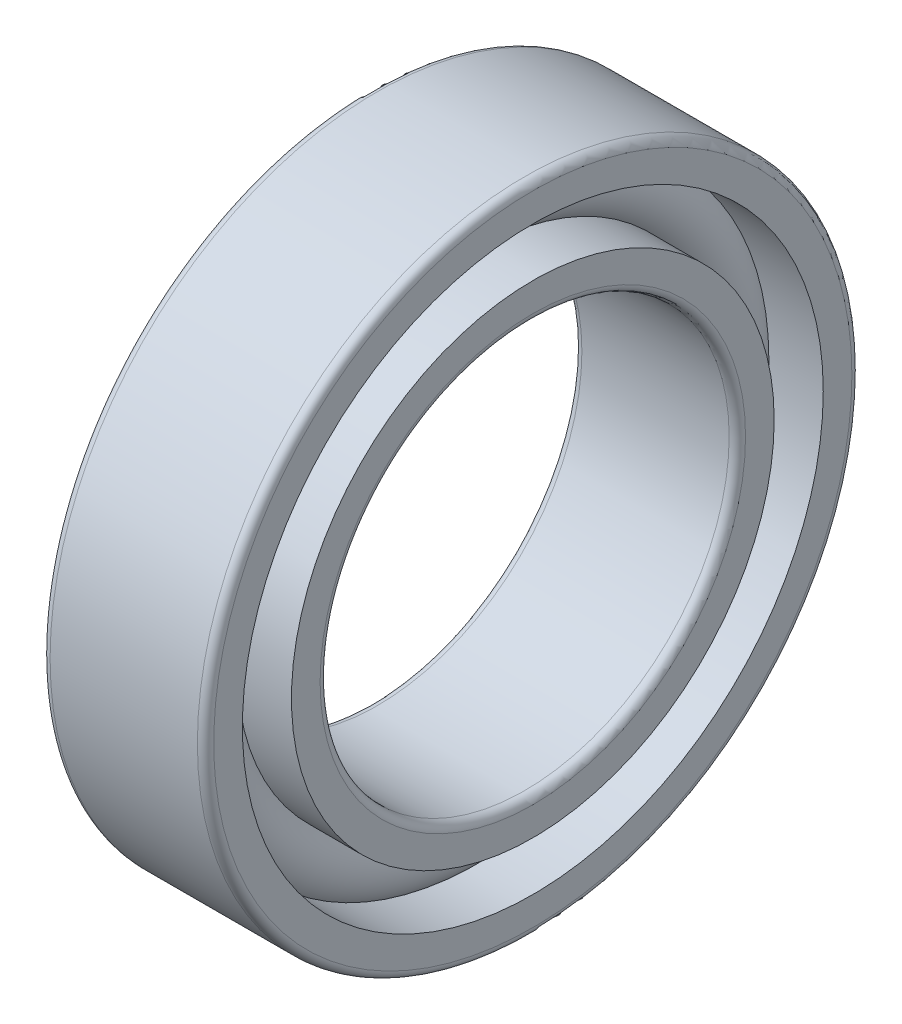
ISO-10303-21;
HEADER;
FILE_DESCRIPTION(('STEP AP214'),'2;1');
FILE_NAME('part.step','',(''),(''),'','','');
FILE_SCHEMA(('AUTOMOTIVE_DESIGN { 1 0 10303 214 1 1 1 1 }'));
ENDSEC;
DATA;
#1=APPLICATION_CONTEXT('core data for automotive mechanical design processes');
#2=APPLICATION_PROTOCOL_DEFINITION('international standard','automotive_design',2000,#1);
#3=PRODUCT_CONTEXT('',#1,'mechanical');
#4=PRODUCT('Part','Part','',(#3));
#5=PRODUCT_RELATED_PRODUCT_CATEGORY('part','',(#4));
#6=PRODUCT_DEFINITION_FORMATION('','',#4);
#7=PRODUCT_DEFINITION_CONTEXT('part definition',#1,'design');
#8=PRODUCT_DEFINITION('design','',#6,#7);
#9=PRODUCT_DEFINITION_SHAPE('','',#8);
#10=(LENGTH_UNIT() NAMED_UNIT(*) SI_UNIT(.MILLI.,.METRE.));
#11=(NAMED_UNIT(*) PLANE_ANGLE_UNIT() SI_UNIT($,.RADIAN.));
#12=(NAMED_UNIT(*) SI_UNIT($,.STERADIAN.) SOLID_ANGLE_UNIT());
#13=UNCERTAINTY_MEASURE_WITH_UNIT(LENGTH_MEASURE(1.E-05),#10,'distance_accuracy_value','');
#14=(GEOMETRIC_REPRESENTATION_CONTEXT(3) GLOBAL_UNCERTAINTY_ASSIGNED_CONTEXT((#13)) GLOBAL_UNIT_ASSIGNED_CONTEXT((#10,
#11,#12)) REPRESENTATION_CONTEXT('',''));
#15=CARTESIAN_POINT('',(0.,0.,0.));
#16=DIRECTION('',(0.,0.,1.));
#17=DIRECTION('',(1.,0.,0.));
#18=AXIS2_PLACEMENT_3D('',#15,#16,#17);
#19=CARTESIAN_POINT('',(0.,0.,0.));
#20=DIRECTION('',(-1.,0.,0.));
#21=DIRECTION('',(0.,0.,1.));
#22=AXIS2_PLACEMENT_3D('',#19,#20,#21);
#23=TOROIDAL_SURFACE('',#22,9.75,1.35);
#24=CARTESIAN_POINT('',(1.0062305898749,0.,0.));
#25=DIRECTION('',(-1.,0.,0.));
#26=DIRECTION('',(0.,0.,1.));
#27=AXIS2_PLACEMENT_3D('',#24,#25,#26);
#28=CIRCLE('',#27,10.65);
#29=CARTESIAN_POINT('',(1.0062305898749,0.,10.65));
#30=VERTEX_POINT('',#29);
#31=EDGE_CURVE('E35',#30,#30,#28,.F.);
#32=ORIENTED_EDGE('',*,*,#31,.T.);
#33=EDGE_LOOP('',(#32));
#34=FACE_BOUND('',#33,.T.);
#35=CARTESIAN_POINT('',(1.0062305898749,0.,0.));
#36=DIRECTION('',(-1.,0.,0.));
#37=DIRECTION('',(0.,0.,1.));
#38=AXIS2_PLACEMENT_3D('',#35,#36,#37);
#39=CIRCLE('',#38,8.85);
#40=CARTESIAN_POINT('',(1.0062305898749,0.,8.85));
#41=VERTEX_POINT('',#40);
#42=EDGE_CURVE('E10',#41,#41,#39,.T.);
#43=ORIENTED_EDGE('',*,*,#42,.T.);
#44=EDGE_LOOP('',(#43));
#45=FACE_BOUND('',#44,.T.);
#46=ADVANCED_FACE('F31',(#34,#45),#23,.T.);
#47=CARTESIAN_POINT('',(-20.6375,0.,0.));
#48=DIRECTION('',(1.,0.,0.));
#49=DIRECTION('',(0.,0.,-1.));
#50=AXIS2_PLACEMENT_3D('',#47,#48,#49);
#51=CYLINDRICAL_SURFACE('',#50,8.85);
#52=CARTESIAN_POINT('',(3.,0.,0.));
#53=DIRECTION('',(1.,0.,0.));
#54=DIRECTION('',(0.,0.,-1.));
#55=AXIS2_PLACEMENT_3D('',#52,#53,#54);
#56=CIRCLE('',#55,8.85);
#57=CARTESIAN_POINT('',(3.,0.,-8.85));
#58=VERTEX_POINT('',#57);
#59=EDGE_CURVE('E44',#58,#58,#56,.T.);
#60=ORIENTED_EDGE('',*,*,#59,.F.);
#61=EDGE_LOOP('',(#60));
#62=FACE_BOUND('',#61,.T.);
#63=ORIENTED_EDGE('',*,*,#42,.F.);
#64=EDGE_LOOP('',(#63));
#65=FACE_BOUND('',#64,.T.);
#66=ADVANCED_FACE('F83',(#62,#65),#51,.T.);
#67=CARTESIAN_POINT('',(-20.6375,0.,0.));
#68=DIRECTION('',(1.,0.,0.));
#69=DIRECTION('',(0.,0.,-1.));
#70=AXIS2_PLACEMENT_3D('',#67,#68,#69);
#71=CYLINDRICAL_SURFACE('',#70,8.85);
#72=CARTESIAN_POINT('',(-3.,0.,0.));
#73=DIRECTION('',(1.,0.,0.));
#74=DIRECTION('',(0.,0.,-1.));
#75=AXIS2_PLACEMENT_3D('',#72,#73,#74);
#76=CIRCLE('',#75,8.85);
#77=CARTESIAN_POINT('',(-3.,0.,-8.85));
#78=VERTEX_POINT('',#77);
#79=EDGE_CURVE('E53',#78,#78,#76,.T.);
#80=ORIENTED_EDGE('',*,*,#79,.T.);
#81=EDGE_LOOP('',(#80));
#82=FACE_BOUND('',#81,.T.);
#83=CARTESIAN_POINT('',(-1.0062305898749,0.,0.));
#84=DIRECTION('',(1.,0.,0.));
#85=DIRECTION('',(0.,0.,-1.));
#86=AXIS2_PLACEMENT_3D('',#83,#84,#85);
#87=CIRCLE('',#86,8.85);
#88=CARTESIAN_POINT('',(-1.0062305898749,0.,-8.85));
#89=VERTEX_POINT('',#88);
#90=EDGE_CURVE('E39',#89,#89,#87,.T.);
#91=ORIENTED_EDGE('',*,*,#90,.F.);
#92=EDGE_LOOP('',(#91));
#93=FACE_BOUND('',#92,.T.);
#94=ADVANCED_FACE('F86',(#82,#93),#71,.T.);
#95=CARTESIAN_POINT('',(3.,7.8,0.));
#96=DIRECTION('',(1.,0.,0.));
#97=DIRECTION('',(0.,0.,-1.));
#98=AXIS2_PLACEMENT_3D('',#95,#96,#97);
#99=PLANE('',#98);
#100=ORIENTED_EDGE('',*,*,#59,.T.);
#101=EDGE_LOOP('',(#100));
#102=FACE_BOUND('',#101,.T.);
#103=CARTESIAN_POINT('',(3.,0.,0.));
#104=DIRECTION('',(1.,0.,0.));
#105=DIRECTION('',(0.,0.,-1.));
#106=AXIS2_PLACEMENT_3D('',#103,#104,#105);
#107=CIRCLE('',#106,7.8);
#108=CARTESIAN_POINT('',(3.,0.,-7.8));
#109=VERTEX_POINT('',#108);
#110=EDGE_CURVE('E75',#109,#109,#107,.T.);
#111=ORIENTED_EDGE('',*,*,#110,.F.);
#112=EDGE_LOOP('',(#111));
#113=FACE_BOUND('',#112,.T.);
#114=ADVANCED_FACE('F80',(#102,#113),#99,.T.);
#115=CARTESIAN_POINT('',(2.7,0.,0.));
#116=DIRECTION('',(1.,0.,0.));
#117=DIRECTION('',(0.,0.,-1.));
#118=AXIS2_PLACEMENT_3D('',#115,#116,#117);
#119=TOROIDAL_SURFACE('',#118,7.8,0.3);
#120=ORIENTED_EDGE('',*,*,#110,.T.);
#121=EDGE_LOOP('',(#120));
#122=FACE_BOUND('',#121,.T.);
#123=CARTESIAN_POINT('',(2.7,0.,0.));
#124=DIRECTION('',(1.,0.,0.));
#125=DIRECTION('',(0.,0.,-1.));
#126=AXIS2_PLACEMENT_3D('',#123,#124,#125);
#127=CIRCLE('',#126,7.5);
#128=CARTESIAN_POINT('',(2.7,0.,-7.5));
#129=VERTEX_POINT('',#128);
#130=EDGE_CURVE('E72',#129,#129,#127,.T.);
#131=ORIENTED_EDGE('',*,*,#130,.F.);
#132=EDGE_LOOP('',(#131));
#133=FACE_BOUND('',#132,.T.);
#134=ADVANCED_FACE('F97',(#122,#133),#119,.T.);
#135=CARTESIAN_POINT('',(-20.6375,0.,0.));
#136=DIRECTION('',(1.,0.,0.));
#137=DIRECTION('',(0.,0.,-1.));
#138=AXIS2_PLACEMENT_3D('',#135,#136,#137);
#139=CYLINDRICAL_SURFACE('',#138,7.5);
#140=ORIENTED_EDGE('',*,*,#130,.T.);
#141=EDGE_LOOP('',(#140));
#142=FACE_BOUND('',#141,.T.);
#143=CARTESIAN_POINT('',(-2.7,0.,0.));
#144=DIRECTION('',(1.,0.,0.));
#145=DIRECTION('',(0.,0.,-1.));
#146=AXIS2_PLACEMENT_3D('',#143,#144,#145);
#147=CIRCLE('',#146,7.5);
#148=CARTESIAN_POINT('',(-2.7,0.,-7.5));
#149=VERTEX_POINT('',#148);
#150=EDGE_CURVE('E69',#149,#149,#147,.T.);
#151=ORIENTED_EDGE('',*,*,#150,.F.);
#152=EDGE_LOOP('',(#151));
#153=FACE_BOUND('',#152,.T.);
#154=ADVANCED_FACE('F100',(#142,#153),#139,.F.);
#155=CARTESIAN_POINT('',(-2.7,0.,0.));
#156=DIRECTION('',(1.,0.,0.));
#157=DIRECTION('',(0.,0.,-1.));
#158=AXIS2_PLACEMENT_3D('',#155,#156,#157);
#159=TOROIDAL_SURFACE('',#158,7.8,0.3);
#160=ORIENTED_EDGE('',*,*,#150,.T.);
#161=EDGE_LOOP('',(#160));
#162=FACE_BOUND('',#161,.T.);
#163=CARTESIAN_POINT('',(-3.,0.,0.));
#164=DIRECTION('',(1.,0.,0.));
#165=DIRECTION('',(0.,0.,-1.));
#166=AXIS2_PLACEMENT_3D('',#163,#164,#165);
#167=CIRCLE('',#166,7.8);
#168=CARTESIAN_POINT('',(-3.,0.,-7.8));
#169=VERTEX_POINT('',#168);
#170=EDGE_CURVE('E66',#169,#169,#167,.T.);
#171=ORIENTED_EDGE('',*,*,#170,.F.);
#172=EDGE_LOOP('',(#171));
#173=FACE_BOUND('',#172,.T.);
#174=ADVANCED_FACE('F104',(#162,#173),#159,.T.);
#175=CARTESIAN_POINT('',(-3.,8.85,0.));
#176=DIRECTION('',(-1.,0.,0.));
#177=DIRECTION('',(0.,0.,1.));
#178=AXIS2_PLACEMENT_3D('',#175,#176,#177);
#179=PLANE('',#178);
#180=ORIENTED_EDGE('',*,*,#170,.T.);
#181=EDGE_LOOP('',(#180));
#182=FACE_BOUND('',#181,.T.);
#183=ORIENTED_EDGE('',*,*,#79,.F.);
#184=EDGE_LOOP('',(#183));
#185=FACE_BOUND('',#184,.T.);
#186=ADVANCED_FACE('F108',(#182,#185),#179,.T.);
#187=CARTESIAN_POINT('',(-1.0062305898749,0.,0.));
#188=DIRECTION('',(1.,0.,0.));
#189=DIRECTION('',(0.,0.,-1.));
#190=AXIS2_PLACEMENT_3D('',#187,#188,#189);
#191=CIRCLE('',#190,10.65);
#192=CARTESIAN_POINT('',(-1.0062305898749,0.,-10.65));
#193=VERTEX_POINT('',#192);
#194=EDGE_CURVE('E47',#193,#193,#191,.F.);
#195=ORIENTED_EDGE('',*,*,#194,.T.);
#196=EDGE_LOOP('',(#195));
#197=FACE_BOUND('',#196,.T.);
#198=ORIENTED_EDGE('',*,*,#90,.T.);
#199=EDGE_LOOP('',(#198));
#200=FACE_BOUND('',#199,.T.);
#201=ADVANCED_FACE('F33',(#197,#200),#23,.T.);
#202=CARTESIAN_POINT('',(-20.6375,0.,0.));
#203=DIRECTION('',(1.,0.,0.));
#204=DIRECTION('',(0.,0.,-1.));
#205=AXIS2_PLACEMENT_3D('',#202,#203,#204);
#206=CYLINDRICAL_SURFACE('',#205,10.65);
#207=CARTESIAN_POINT('',(3.,0.,0.));
#208=DIRECTION('',(1.,0.,0.));
#209=DIRECTION('',(0.,0.,-1.));
#210=AXIS2_PLACEMENT_3D('',#207,#208,#209);
#211=CIRCLE('',#210,10.65);
#212=CARTESIAN_POINT('',(3.,0.,-10.65));
#213=VERTEX_POINT('',#212);
#214=EDGE_CURVE('E49',#213,#213,#211,.T.);
#215=ORIENTED_EDGE('',*,*,#214,.T.);
#216=EDGE_LOOP('',(#215));
#217=FACE_BOUND('',#216,.T.);
#218=ORIENTED_EDGE('',*,*,#31,.F.);
#219=EDGE_LOOP('',(#218));
#220=FACE_BOUND('',#219,.T.);
#221=ADVANCED_FACE('F113',(#217,#220),#206,.F.);
#222=CARTESIAN_POINT('',(-20.6375,0.,0.));
#223=DIRECTION('',(1.,0.,0.));
#224=DIRECTION('',(0.,0.,-1.));
#225=AXIS2_PLACEMENT_3D('',#222,#223,#224);
#226=CYLINDRICAL_SURFACE('',#225,10.65);
#227=CARTESIAN_POINT('',(-3.,0.,0.));
#228=DIRECTION('',(1.,0.,0.));
#229=DIRECTION('',(0.,0.,-1.));
#230=AXIS2_PLACEMENT_3D('',#227,#228,#229);
#231=CIRCLE('',#230,10.65);
#232=CARTESIAN_POINT('',(-3.,0.,-10.65));
#233=VERTEX_POINT('',#232);
#234=EDGE_CURVE('E144',#233,#233,#231,.T.);
#235=ORIENTED_EDGE('',*,*,#234,.F.);
#236=EDGE_LOOP('',(#235));
#237=FACE_BOUND('',#236,.T.);
#238=ORIENTED_EDGE('',*,*,#194,.F.);
#239=EDGE_LOOP('',(#238));
#240=FACE_BOUND('',#239,.T.);
#241=ADVANCED_FACE('F116',(#237,#240),#226,.F.);
#242=CARTESIAN_POINT('',(3.,11.7,0.));
#243=DIRECTION('',(1.,0.,0.));
#244=DIRECTION('',(0.,0.,-1.));
#245=AXIS2_PLACEMENT_3D('',#242,#243,#244);
#246=PLANE('',#245);
#247=CARTESIAN_POINT('',(3.,0.,0.));
#248=DIRECTION('',(1.,0.,0.));
#249=DIRECTION('',(0.,0.,-1.));
#250=AXIS2_PLACEMENT_3D('',#247,#248,#249);
#251=CIRCLE('',#250,11.7);
#252=CARTESIAN_POINT('',(3.,0.,-11.7));
#253=VERTEX_POINT('',#252);
#254=EDGE_CURVE('E55',#253,#253,#251,.T.);
#255=ORIENTED_EDGE('',*,*,#254,.T.);
#256=EDGE_LOOP('',(#255));
#257=FACE_BOUND('',#256,.T.);
#258=ORIENTED_EDGE('',*,*,#214,.F.);
#259=EDGE_LOOP('',(#258));
#260=FACE_BOUND('',#259,.T.);
#261=ADVANCED_FACE('F117',(#257,#260),#246,.T.);
#262=CARTESIAN_POINT('',(2.7,0.,0.));
#263=DIRECTION('',(1.,0.,0.));
#264=DIRECTION('',(0.,0.,-1.));
#265=AXIS2_PLACEMENT_3D('',#262,#263,#264);
#266=TOROIDAL_SURFACE('',#265,11.7,0.299999999999998);
#267=CARTESIAN_POINT('',(2.7,0.,0.));
#268=DIRECTION('',(1.,0.,0.));
#269=DIRECTION('',(0.,0.,-1.));
#270=AXIS2_PLACEMENT_3D('',#267,#268,#269);
#271=CIRCLE('',#270,12.);
#272=CARTESIAN_POINT('',(2.7,0.,-12.));
#273=VERTEX_POINT('',#272);
#274=EDGE_CURVE('E60',#273,#273,#271,.T.);
#275=ORIENTED_EDGE('',*,*,#274,.T.);
#276=EDGE_LOOP('',(#275));
#277=FACE_BOUND('',#276,.T.);
#278=ORIENTED_EDGE('',*,*,#254,.F.);
#279=EDGE_LOOP('',(#278));
#280=FACE_BOUND('',#279,.T.);
#281=ADVANCED_FACE('F120',(#277,#280),#266,.T.);
#282=CARTESIAN_POINT('',(-20.6375,0.,0.));
#283=DIRECTION('',(1.,0.,0.));
#284=DIRECTION('',(0.,0.,-1.));
#285=AXIS2_PLACEMENT_3D('',#282,#283,#284);
#286=CYLINDRICAL_SURFACE('',#285,12.);
#287=CARTESIAN_POINT('',(-2.7,0.,0.));
#288=DIRECTION('',(1.,0.,0.));
#289=DIRECTION('',(0.,0.,-1.));
#290=AXIS2_PLACEMENT_3D('',#287,#288,#289);
#291=CIRCLE('',#290,12.);
#292=CARTESIAN_POINT('',(-2.7,0.,-12.));
#293=VERTEX_POINT('',#292);
#294=EDGE_CURVE('E148',#293,#293,#291,.T.);
#295=ORIENTED_EDGE('',*,*,#294,.T.);
#296=EDGE_LOOP('',(#295));
#297=FACE_BOUND('',#296,.T.);
#298=ORIENTED_EDGE('',*,*,#274,.F.);
#299=EDGE_LOOP('',(#298));
#300=FACE_BOUND('',#299,.T.);
#301=ADVANCED_FACE('F124',(#297,#300),#286,.T.);
#302=CARTESIAN_POINT('',(-2.7,0.,0.));
#303=DIRECTION('',(1.,0.,0.));
#304=DIRECTION('',(0.,0.,-1.));
#305=AXIS2_PLACEMENT_3D('',#302,#303,#304);
#306=TOROIDAL_SURFACE('',#305,11.7,0.299999999999998);
#307=CARTESIAN_POINT('',(-3.,0.,0.));
#308=DIRECTION('',(1.,0.,0.));
#309=DIRECTION('',(0.,0.,-1.));
#310=AXIS2_PLACEMENT_3D('',#307,#308,#309);
#311=CIRCLE('',#310,11.7);
#312=CARTESIAN_POINT('',(-3.,0.,-11.7));
#313=VERTEX_POINT('',#312);
#314=EDGE_CURVE('E145',#313,#313,#311,.T.);
#315=ORIENTED_EDGE('',*,*,#314,.T.);
#316=EDGE_LOOP('',(#315));
#317=FACE_BOUND('',#316,.T.);
#318=ORIENTED_EDGE('',*,*,#294,.F.);
#319=EDGE_LOOP('',(#318));
#320=FACE_BOUND('',#319,.T.);
#321=ADVANCED_FACE('F128',(#317,#320),#306,.T.);
#322=CARTESIAN_POINT('',(-3.,10.65,0.));
#323=DIRECTION('',(-1.,0.,0.));
#324=DIRECTION('',(0.,0.,1.));
#325=AXIS2_PLACEMENT_3D('',#322,#323,#324);
#326=PLANE('',#325);
#327=ORIENTED_EDGE('',*,*,#234,.T.);
#328=EDGE_LOOP('',(#327));
#329=FACE_BOUND('',#328,.T.);
#330=ORIENTED_EDGE('',*,*,#314,.F.);
#331=EDGE_LOOP('',(#330));
#332=FACE_BOUND('',#331,.T.);
#333=ADVANCED_FACE('F132',(#329,#332),#326,.T.);
#334=CLOSED_SHELL('',(#46,#66,#94,#114,#134,#154,#174,#186,#201,#221,#241,#261,#281,#301,#321,#333));
#335=MANIFOLD_SOLID_BREP('B2',#334);
#336=ADVANCED_BREP_SHAPE_REPRESENTATION('',(#18,#335),#14);
#337=SHAPE_DEFINITION_REPRESENTATION(#9,#336);
ENDSEC;
END-ISO-10303-21;
